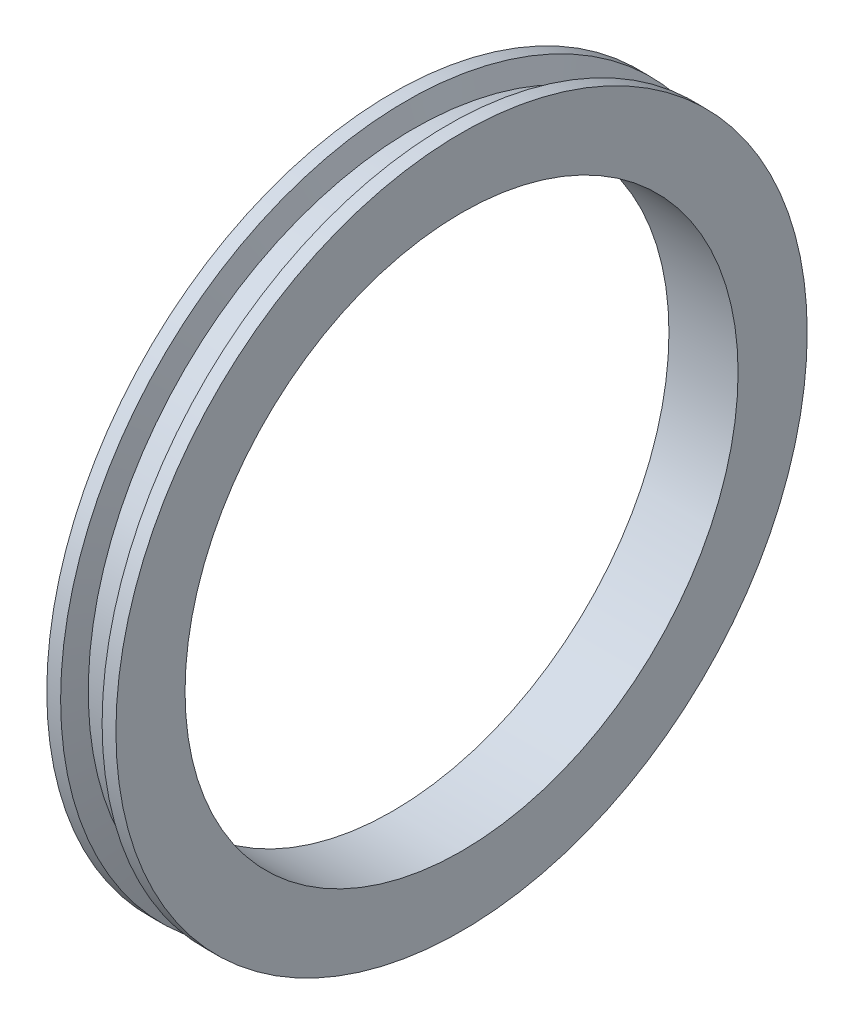
ISO-10303-21;
HEADER;
FILE_DESCRIPTION(('STEP AP214'),'2;1');
FILE_NAME('part.step','',(''),(''),'','','');
FILE_SCHEMA(('AUTOMOTIVE_DESIGN { 1 0 10303 214 1 1 1 1 }'));
ENDSEC;
DATA;
#1=APPLICATION_CONTEXT('core data for automotive mechanical design processes');
#2=APPLICATION_PROTOCOL_DEFINITION('international standard','automotive_design',2000,#1);
#3=PRODUCT_CONTEXT('',#1,'mechanical');
#4=PRODUCT('Part','Part','',(#3));
#5=PRODUCT_RELATED_PRODUCT_CATEGORY('part','',(#4));
#6=PRODUCT_DEFINITION_FORMATION('','',#4);
#7=PRODUCT_DEFINITION_CONTEXT('part definition',#1,'design');
#8=PRODUCT_DEFINITION('design','',#6,#7);
#9=PRODUCT_DEFINITION_SHAPE('','',#8);
#10=(LENGTH_UNIT() NAMED_UNIT(*) SI_UNIT(.MILLI.,.METRE.));
#11=(NAMED_UNIT(*) PLANE_ANGLE_UNIT() SI_UNIT($,.RADIAN.));
#12=(NAMED_UNIT(*) SI_UNIT($,.STERADIAN.) SOLID_ANGLE_UNIT());
#13=UNCERTAINTY_MEASURE_WITH_UNIT(LENGTH_MEASURE(1.E-05),#10,'distance_accuracy_value','');
#14=(GEOMETRIC_REPRESENTATION_CONTEXT(3) GLOBAL_UNCERTAINTY_ASSIGNED_CONTEXT((#13)) GLOBAL_UNIT_ASSIGNED_CONTEXT((#10,
#11,#12)) REPRESENTATION_CONTEXT('',''));
#15=CARTESIAN_POINT('',(0.,0.,0.));
#16=DIRECTION('',(0.,0.,1.));
#17=DIRECTION('',(1.,0.,0.));
#18=AXIS2_PLACEMENT_3D('',#15,#16,#17);
#19=CARTESIAN_POINT('',(0.,0.,0.));
#20=DIRECTION('',(-1.,0.,0.));
#21=DIRECTION('',(0.,0.,1.));
#22=AXIS2_PLACEMENT_3D('',#19,#20,#21);
#23=PLANE('',#22);
#24=CARTESIAN_POINT('',(0.,0.,0.));
#25=DIRECTION('',(1.,0.,0.));
#26=DIRECTION('',(0.,0.,-1.));
#27=AXIS2_PLACEMENT_3D('',#24,#25,#26);
#28=CIRCLE('',#27,40.);
#29=CARTESIAN_POINT('',(0.,0.,-40.));
#30=VERTEX_POINT('',#29);
#31=EDGE_CURVE('E68',#30,#30,#28,.T.);
#32=ORIENTED_EDGE('',*,*,#31,.T.);
#33=EDGE_LOOP('',(#32));
#34=FACE_BOUND('',#33,.T.);
#35=CARTESIAN_POINT('',(0.,0.,0.));
#36=DIRECTION('',(1.,0.,0.));
#37=DIRECTION('',(0.,0.,-1.));
#38=AXIS2_PLACEMENT_3D('',#35,#36,#37);
#39=CIRCLE('',#38,50.);
#40=CARTESIAN_POINT('',(0.,0.,-50.));
#41=VERTEX_POINT('',#40);
#42=EDGE_CURVE('E10',#41,#41,#39,.T.);
#43=ORIENTED_EDGE('',*,*,#42,.F.);
#44=EDGE_LOOP('',(#43));
#45=FACE_BOUND('',#44,.T.);
#46=ADVANCED_FACE('F37',(#34,#45),#23,.T.);
#47=CARTESIAN_POINT('',(10.,0.,0.));
#48=DIRECTION('',(1.,0.,0.));
#49=DIRECTION('',(0.,0.,-1.));
#50=AXIS2_PLACEMENT_3D('',#47,#48,#49);
#51=CYLINDRICAL_SURFACE('',#50,50.);
#52=ORIENTED_EDGE('',*,*,#42,.T.);
#53=EDGE_LOOP('',(#52));
#54=FACE_BOUND('',#53,.T.);
#55=CARTESIAN_POINT('',(2.,0.,0.));
#56=DIRECTION('',(1.,0.,0.));
#57=DIRECTION('',(0.,0.,-1.));
#58=AXIS2_PLACEMENT_3D('',#55,#56,#57);
#59=CIRCLE('',#58,50.);
#60=CARTESIAN_POINT('',(2.,0.,-50.));
#61=VERTEX_POINT('',#60);
#62=EDGE_CURVE('E44',#61,#61,#59,.T.);
#63=ORIENTED_EDGE('',*,*,#62,.F.);
#64=EDGE_LOOP('',(#63));
#65=FACE_BOUND('',#64,.T.);
#66=ADVANCED_FACE('F103',(#54,#65),#51,.T.);
#67=CARTESIAN_POINT('',(3.,0.,0.));
#68=DIRECTION('',(-1.,0.,0.));
#69=DIRECTION('',(0.,0.,1.));
#70=AXIS2_PLACEMENT_3D('',#67,#68,#69);
#71=CONICAL_SURFACE('',#70,47.,1.24904577239825);
#72=ORIENTED_EDGE('',*,*,#62,.T.);
#73=EDGE_LOOP('',(#72));
#74=FACE_BOUND('',#73,.T.);
#75=CARTESIAN_POINT('',(3.,0.,0.));
#76=DIRECTION('',(1.,0.,0.));
#77=DIRECTION('',(0.,0.,-1.));
#78=AXIS2_PLACEMENT_3D('',#75,#76,#77);
#79=CIRCLE('',#78,47.);
#80=CARTESIAN_POINT('',(3.,0.,-47.));
#81=VERTEX_POINT('',#80);
#82=EDGE_CURVE('E49',#81,#81,#79,.T.);
#83=ORIENTED_EDGE('',*,*,#82,.F.);
#84=EDGE_LOOP('',(#83));
#85=FACE_BOUND('',#84,.T.);
#86=ADVANCED_FACE('F107',(#74,#85),#71,.T.);
#87=CARTESIAN_POINT('',(10.,0.,0.));
#88=DIRECTION('',(1.,0.,0.));
#89=DIRECTION('',(0.,0.,-1.));
#90=AXIS2_PLACEMENT_3D('',#87,#88,#89);
#91=CYLINDRICAL_SURFACE('',#90,47.);
#92=ORIENTED_EDGE('',*,*,#82,.T.);
#93=EDGE_LOOP('',(#92));
#94=FACE_BOUND('',#93,.T.);
#95=CARTESIAN_POINT('',(7.,0.,0.));
#96=DIRECTION('',(1.,0.,0.));
#97=DIRECTION('',(0.,0.,-1.));
#98=AXIS2_PLACEMENT_3D('',#95,#96,#97);
#99=CIRCLE('',#98,47.);
#100=CARTESIAN_POINT('',(7.,0.,-47.));
#101=VERTEX_POINT('',#100);
#102=EDGE_CURVE('E54',#101,#101,#99,.T.);
#103=ORIENTED_EDGE('',*,*,#102,.F.);
#104=EDGE_LOOP('',(#103));
#105=FACE_BOUND('',#104,.T.);
#106=ADVANCED_FACE('F99',(#94,#105),#91,.T.);
#107=CARTESIAN_POINT('',(8.,0.,0.));
#108=DIRECTION('',(1.,0.,0.));
#109=DIRECTION('',(0.,0.,-1.));
#110=AXIS2_PLACEMENT_3D('',#107,#108,#109);
#111=CONICAL_SURFACE('',#110,50.,1.24904577239825);
#112=ORIENTED_EDGE('',*,*,#102,.T.);
#113=EDGE_LOOP('',(#112));
#114=FACE_BOUND('',#113,.T.);
#115=CARTESIAN_POINT('',(8.,0.,0.));
#116=DIRECTION('',(1.,0.,0.));
#117=DIRECTION('',(0.,0.,-1.));
#118=AXIS2_PLACEMENT_3D('',#115,#116,#117);
#119=CIRCLE('',#118,50.);
#120=CARTESIAN_POINT('',(8.,0.,-50.));
#121=VERTEX_POINT('',#120);
#122=EDGE_CURVE('E60',#121,#121,#119,.T.);
#123=ORIENTED_EDGE('',*,*,#122,.F.);
#124=EDGE_LOOP('',(#123));
#125=FACE_BOUND('',#124,.T.);
#126=ADVANCED_FACE('F93',(#114,#125),#111,.T.);
#127=CARTESIAN_POINT('',(10.,0.,0.));
#128=DIRECTION('',(1.,0.,0.));
#129=DIRECTION('',(0.,0.,-1.));
#130=AXIS2_PLACEMENT_3D('',#127,#128,#129);
#131=CYLINDRICAL_SURFACE('',#130,50.);
#132=ORIENTED_EDGE('',*,*,#122,.T.);
#133=EDGE_LOOP('',(#132));
#134=FACE_BOUND('',#133,.T.);
#135=CARTESIAN_POINT('',(10.,0.,0.));
#136=DIRECTION('',(1.,0.,0.));
#137=DIRECTION('',(0.,0.,-1.));
#138=AXIS2_PLACEMENT_3D('',#135,#136,#137);
#139=CIRCLE('',#138,50.);
#140=CARTESIAN_POINT('',(10.,0.,-50.));
#141=VERTEX_POINT('',#140);
#142=EDGE_CURVE('E64',#141,#141,#139,.T.);
#143=ORIENTED_EDGE('',*,*,#142,.F.);
#144=EDGE_LOOP('',(#143));
#145=FACE_BOUND('',#144,.T.);
#146=ADVANCED_FACE('F88',(#134,#145),#131,.T.);
#147=CARTESIAN_POINT('',(10.,50.,0.));
#148=DIRECTION('',(1.,0.,0.));
#149=DIRECTION('',(0.,0.,-1.));
#150=AXIS2_PLACEMENT_3D('',#147,#148,#149);
#151=PLANE('',#150);
#152=CARTESIAN_POINT('',(10.,0.,0.));
#153=DIRECTION('',(1.,0.,0.));
#154=DIRECTION('',(0.,0.,-1.));
#155=AXIS2_PLACEMENT_3D('',#152,#153,#154);
#156=CIRCLE('',#155,40.);
#157=CARTESIAN_POINT('',(10.,0.,-40.));
#158=VERTEX_POINT('',#157);
#159=EDGE_CURVE('E69',#158,#158,#156,.T.);
#160=ORIENTED_EDGE('',*,*,#159,.F.);
#161=EDGE_LOOP('',(#160));
#162=FACE_BOUND('',#161,.T.);
#163=ORIENTED_EDGE('',*,*,#142,.T.);
#164=EDGE_LOOP('',(#163));
#165=FACE_BOUND('',#164,.T.);
#166=ADVANCED_FACE('F82',(#162,#165),#151,.T.);
#167=CARTESIAN_POINT('',(0.,0.,0.));
#168=DIRECTION('',(1.,0.,0.));
#169=DIRECTION('',(0.,0.,-1.));
#170=AXIS2_PLACEMENT_3D('',#167,#168,#169);
#171=CYLINDRICAL_SURFACE('',#170,40.);
#172=ORIENTED_EDGE('',*,*,#31,.F.);
#173=EDGE_LOOP('',(#172));
#174=FACE_BOUND('',#173,.T.);
#175=ORIENTED_EDGE('',*,*,#159,.T.);
#176=EDGE_LOOP('',(#175));
#177=FACE_BOUND('',#176,.T.);
#178=ADVANCED_FACE('F79',(#174,#177),#171,.F.);
#179=CLOSED_SHELL('',(#46,#66,#86,#106,#126,#146,#166,#178));
#180=MANIFOLD_SOLID_BREP('B2',#179);
#181=ADVANCED_BREP_SHAPE_REPRESENTATION('',(#18,#180),#14);
#182=SHAPE_DEFINITION_REPRESENTATION(#9,#181);
ENDSEC;
END-ISO-10303-21;
